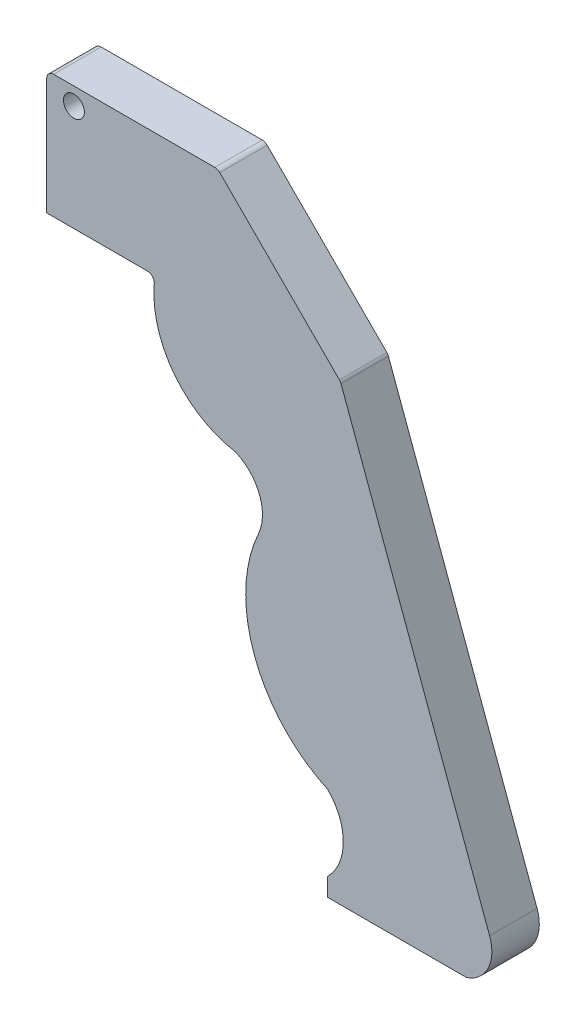
ISO-10303-21;
HEADER;
FILE_DESCRIPTION(('STEP AP214'),'2;1');
FILE_NAME('part.step','',(''),(''),'','','');
FILE_SCHEMA(('AUTOMOTIVE_DESIGN { 1 0 10303 214 1 1 1 1 }'));
ENDSEC;
DATA;
#1=APPLICATION_CONTEXT('core data for automotive mechanical design processes');
#2=APPLICATION_PROTOCOL_DEFINITION('international standard','automotive_design',2000,#1);
#3=PRODUCT_CONTEXT('',#1,'mechanical');
#4=PRODUCT('Part','Part','',(#3));
#5=PRODUCT_RELATED_PRODUCT_CATEGORY('part','',(#4));
#6=PRODUCT_DEFINITION_FORMATION('','',#4);
#7=PRODUCT_DEFINITION_CONTEXT('part definition',#1,'design');
#8=PRODUCT_DEFINITION('design','',#6,#7);
#9=PRODUCT_DEFINITION_SHAPE('','',#8);
#10=(LENGTH_UNIT() NAMED_UNIT(*) SI_UNIT(.MILLI.,.METRE.));
#11=(NAMED_UNIT(*) PLANE_ANGLE_UNIT() SI_UNIT($,.RADIAN.));
#12=(NAMED_UNIT(*) SI_UNIT($,.STERADIAN.) SOLID_ANGLE_UNIT());
#13=UNCERTAINTY_MEASURE_WITH_UNIT(LENGTH_MEASURE(1.E-05),#10,'distance_accuracy_value','');
#14=(GEOMETRIC_REPRESENTATION_CONTEXT(3) GLOBAL_UNCERTAINTY_ASSIGNED_CONTEXT((#13)) GLOBAL_UNIT_ASSIGNED_CONTEXT((#10,
#11,#12)) REPRESENTATION_CONTEXT('',''));
#15=CARTESIAN_POINT('',(0.,0.,0.));
#16=DIRECTION('',(0.,0.,1.));
#17=DIRECTION('',(1.,0.,0.));
#18=AXIS2_PLACEMENT_3D('',#15,#16,#17);
#19=CARTESIAN_POINT('',(15.5595718799986,0.,3.4));
#20=DIRECTION('',(0.,1.,0.));
#21=DIRECTION('',(0.,0.,1.));
#22=AXIS2_PLACEMENT_3D('',#19,#20,#21);
#23=PLANE('',#22);
#24=DIRECTION('',(1.,0.,0.));
#25=VECTOR('',#24,1.);
#26=CARTESIAN_POINT('',(15.5595718799986,0.,-3.4));
#27=LINE('',#26,#25);
#28=CARTESIAN_POINT('',(0.,0.,-3.4));
#29=VERTEX_POINT('',#28);
#30=CARTESIAN_POINT('',(14.4252310967925,0.,-3.4));
#31=VERTEX_POINT('',#30);
#32=EDGE_CURVE('E201',#29,#31,#27,.T.);
#33=ORIENTED_EDGE('',*,*,#32,.T.);
#34=DIRECTION('',(0.,0.,1.));
#35=VECTOR('',#34,1.);
#36=CARTESIAN_POINT('',(14.4252310967925,0.,3.4));
#37=LINE('',#36,#35);
#38=CARTESIAN_POINT('',(14.4252310967925,0.,3.4));
#39=VERTEX_POINT('',#38);
#40=EDGE_CURVE('E247',#31,#39,#37,.T.);
#41=ORIENTED_EDGE('',*,*,#40,.T.);
#42=DIRECTION('',(1.,0.,0.));
#43=VECTOR('',#42,1.);
#44=CARTESIAN_POINT('',(15.5595718799986,0.,3.4));
#45=LINE('',#44,#43);
#46=CARTESIAN_POINT('',(0.,0.,3.4));
#47=VERTEX_POINT('',#46);
#48=EDGE_CURVE('E163',#47,#39,#45,.T.);
#49=ORIENTED_EDGE('',*,*,#48,.F.);
#50=DIRECTION('',(0.,0.,-1.));
#51=VECTOR('',#50,1.);
#52=CARTESIAN_POINT('',(0.,0.,3.4));
#53=LINE('',#52,#51);
#54=EDGE_CURVE('E200',#47,#29,#53,.T.);
#55=ORIENTED_EDGE('',*,*,#54,.T.);
#56=EDGE_LOOP('',(#33,#41,#49,#55));
#57=FACE_BOUND('',#56,.T.);
#58=ADVANCED_FACE('F39',(#57),#23,.F.);
#59=CARTESIAN_POINT('',(29.3983016917173,-2.31085777021878,3.4));
#60=DIRECTION('',(0.,0.,-1.));
#61=DIRECTION('',(-1.,0.,0.));
#62=AXIS2_PLACEMENT_3D('',#59,#60,#61);
#63=CYLINDRICAL_SURFACE('',#62,14.0303423492063);
#64=CARTESIAN_POINT('',(29.3983016917173,-2.31085777021878,3.4));
#65=DIRECTION('',(0.,0.,1.));
#66=DIRECTION('',(-1.,0.,0.));
#67=AXIS2_PLACEMENT_3D('',#64,#65,#66);
#68=CIRCLE('',#67,14.0303423492063);
#69=CARTESIAN_POINT('',(15.4214206876247,-1.08721409930413,3.4));
#70=VERTEX_POINT('',#69);
#71=CARTESIAN_POINT('',(27.0874439214985,-16.1495875819375,3.4));
#72=VERTEX_POINT('',#71);
#73=EDGE_CURVE('E151',#70,#72,#68,.T.);
#74=ORIENTED_EDGE('',*,*,#73,.F.);
#75=DIRECTION('',(0.,0.,-1.));
#76=VECTOR('',#75,1.);
#77=CARTESIAN_POINT('',(15.4214206876247,-1.08721409930413,3.4));
#78=LINE('',#77,#76);
#79=CARTESIAN_POINT('',(15.4214206876247,-1.08721409930413,-3.4));
#80=VERTEX_POINT('',#79);
#81=EDGE_CURVE('E172',#70,#80,#78,.T.);
#82=ORIENTED_EDGE('',*,*,#81,.T.);
#83=CARTESIAN_POINT('',(29.3983016917173,-2.31085777021878,-3.4));
#84=DIRECTION('',(0.,0.,1.));
#85=DIRECTION('',(-1.,0.,0.));
#86=AXIS2_PLACEMENT_3D('',#83,#84,#85);
#87=CIRCLE('',#86,14.0303423492063);
#88=CARTESIAN_POINT('',(27.0874439214985,-16.1495875819375,-3.4));
#89=VERTEX_POINT('',#88);
#90=EDGE_CURVE('E169',#80,#89,#87,.T.);
#91=ORIENTED_EDGE('',*,*,#90,.T.);
#92=DIRECTION('',(0.,0.,-1.));
#93=VECTOR('',#92,1.);
#94=CARTESIAN_POINT('',(27.0874439214985,-16.1495875819375,3.4));
#95=LINE('',#94,#93);
#96=EDGE_CURVE('E166',#72,#89,#95,.T.);
#97=ORIENTED_EDGE('',*,*,#96,.F.);
#98=EDGE_LOOP('',(#74,#82,#91,#97));
#99=FACE_BOUND('',#98,.T.);
#100=ADVANCED_FACE('F167',(#99),#63,.T.);
#101=CARTESIAN_POINT('',(24.5341654416993,-22.0150061198059,3.4));
#102=DIRECTION('',(0.,0.,-1.));
#103=DIRECTION('',(-1.,0.,0.));
#104=AXIS2_PLACEMENT_3D('',#101,#102,#103);
#105=CYLINDRICAL_SURFACE('',#104,6.39705913836792);
#106=CARTESIAN_POINT('',(24.5341654416993,-22.0150061198059,-3.4));
#107=DIRECTION('',(0.,0.,-1.));
#108=DIRECTION('',(1.,0.,0.));
#109=AXIS2_PLACEMENT_3D('',#106,#107,#108);
#110=CIRCLE('',#109,6.39705913836792);
#111=CARTESIAN_POINT('',(30.3995839795678,-24.5682845996051,-3.4));
#112=VERTEX_POINT('',#111);
#113=EDGE_CURVE('E206',#89,#112,#110,.T.);
#114=ORIENTED_EDGE('',*,*,#113,.T.);
#115=DIRECTION('',(0.,0.,-1.));
#116=VECTOR('',#115,1.);
#117=CARTESIAN_POINT('',(30.3995839795678,-24.5682845996051,3.4));
#118=LINE('',#117,#116);
#119=CARTESIAN_POINT('',(30.3995839795678,-24.5682845996051,3.4));
#120=VERTEX_POINT('',#119);
#121=EDGE_CURVE('E173',#120,#112,#118,.T.);
#122=ORIENTED_EDGE('',*,*,#121,.F.);
#123=CARTESIAN_POINT('',(24.5341654416993,-22.0150061198059,3.4));
#124=DIRECTION('',(0.,0.,-1.));
#125=DIRECTION('',(1.,0.,0.));
#126=AXIS2_PLACEMENT_3D('',#123,#124,#125);
#127=CIRCLE('',#126,6.39705913836792);
#128=EDGE_CURVE('E156',#72,#120,#127,.T.);
#129=ORIENTED_EDGE('',*,*,#128,.F.);
#130=ORIENTED_EDGE('',*,*,#96,.T.);
#131=EDGE_LOOP('',(#114,#122,#129,#130));
#132=FACE_BOUND('',#131,.T.);
#133=ADVANCED_FACE('F175',(#132),#105,.F.);
#134=CARTESIAN_POINT('',(48.7766265018622,-33.0568108300749,3.4));
#135=DIRECTION('',(0.,0.,-1.));
#136=DIRECTION('',(-1.,0.,0.));
#137=AXIS2_PLACEMENT_3D('',#134,#135,#136);
#138=CYLINDRICAL_SURFACE('',#137,20.2427954944862);
#139=CARTESIAN_POINT('',(48.7766265018622,-33.0568108300749,-3.4));
#140=DIRECTION('',(0.,0.,1.));
#141=DIRECTION('',(-1.,0.,0.));
#142=AXIS2_PLACEMENT_3D('',#139,#140,#141);
#143=CIRCLE('',#142,20.2427954944862);
#144=CARTESIAN_POINT('',(40.2881002713919,-51.4338533523691,-3.4));
#145=VERTEX_POINT('',#144);
#146=EDGE_CURVE('E208',#112,#145,#143,.T.);
#147=ORIENTED_EDGE('',*,*,#146,.T.);
#148=DIRECTION('',(0.,0.,-1.));
#149=VECTOR('',#148,1.);
#150=CARTESIAN_POINT('',(40.2881002713919,-51.4338533523691,3.4));
#151=LINE('',#150,#149);
#152=CARTESIAN_POINT('',(40.2881002713919,-51.4338533523691,3.4));
#153=VERTEX_POINT('',#152);
#154=EDGE_CURVE('E242',#153,#145,#151,.T.);
#155=ORIENTED_EDGE('',*,*,#154,.F.);
#156=CARTESIAN_POINT('',(48.7766265018622,-33.0568108300749,3.4));
#157=DIRECTION('',(0.,0.,1.));
#158=DIRECTION('',(-1.,0.,0.));
#159=AXIS2_PLACEMENT_3D('',#156,#157,#158);
#160=CIRCLE('',#159,20.2427954944862);
#161=EDGE_CURVE('E178',#120,#153,#160,.T.);
#162=ORIENTED_EDGE('',*,*,#161,.F.);
#163=ORIENTED_EDGE('',*,*,#121,.T.);
#164=EDGE_LOOP('',(#147,#155,#162,#163));
#165=FACE_BOUND('',#164,.T.);
#166=ADVANCED_FACE('F307',(#165),#138,.T.);
#167=CARTESIAN_POINT('',(34.8950269475765,-56.8269266761845,3.4));
#168=DIRECTION('',(0.,0.,-1.));
#169=DIRECTION('',(-1.,0.,0.));
#170=AXIS2_PLACEMENT_3D('',#167,#168,#169);
#171=CYLINDRICAL_SURFACE('',#170,7.6269574374124);
#172=CARTESIAN_POINT('',(34.8950269475765,-56.8269266761845,-3.4));
#173=DIRECTION('',(0.,0.,-1.));
#174=DIRECTION('',(1.,0.,0.));
#175=AXIS2_PLACEMENT_3D('',#172,#173,#174);
#176=CIRCLE('',#175,7.6269574374124);
#177=CARTESIAN_POINT('',(40.288100271392,-62.22,-3.4));
#178=VERTEX_POINT('',#177);
#179=EDGE_CURVE('E210',#145,#178,#176,.T.);
#180=ORIENTED_EDGE('',*,*,#179,.T.);
#181=DIRECTION('',(0.,0.,-1.));
#182=VECTOR('',#181,1.);
#183=CARTESIAN_POINT('',(40.288100271392,-62.22,3.4));
#184=LINE('',#183,#182);
#185=CARTESIAN_POINT('',(40.288100271392,-62.22,3.4));
#186=VERTEX_POINT('',#185);
#187=EDGE_CURVE('E239',#186,#178,#184,.T.);
#188=ORIENTED_EDGE('',*,*,#187,.F.);
#189=CARTESIAN_POINT('',(34.8950269475765,-56.8269266761845,3.4));
#190=DIRECTION('',(0.,0.,-1.));
#191=DIRECTION('',(1.,0.,0.));
#192=AXIS2_PLACEMENT_3D('',#189,#190,#191);
#193=CIRCLE('',#192,7.6269574374124);
#194=EDGE_CURVE('E180',#153,#186,#193,.T.);
#195=ORIENTED_EDGE('',*,*,#194,.F.);
#196=ORIENTED_EDGE('',*,*,#154,.T.);
#197=EDGE_LOOP('',(#180,#188,#195,#196));
#198=FACE_BOUND('',#197,.T.);
#199=ADVANCED_FACE('F310',(#198),#171,.F.);
#200=CARTESIAN_POINT('',(40.288100271392,-64.84,3.4));
#201=DIRECTION('',(1.,0.,0.));
#202=DIRECTION('',(0.,1.,0.));
#203=AXIS2_PLACEMENT_3D('',#200,#201,#202);
#204=PLANE('',#203);
#205=DIRECTION('',(0.,-1.,0.));
#206=VECTOR('',#205,1.);
#207=CARTESIAN_POINT('',(40.288100271392,-64.84,-3.4));
#208=LINE('',#207,#206);
#209=CARTESIAN_POINT('',(40.288100271392,-64.84,-3.4));
#210=VERTEX_POINT('',#209);
#211=EDGE_CURVE('E212',#178,#210,#208,.T.);
#212=ORIENTED_EDGE('',*,*,#211,.T.);
#213=DIRECTION('',(0.,0.,-1.));
#214=VECTOR('',#213,1.);
#215=CARTESIAN_POINT('',(40.288100271392,-64.84,3.4));
#216=LINE('',#215,#214);
#217=CARTESIAN_POINT('',(40.288100271392,-64.84,3.4));
#218=VERTEX_POINT('',#217);
#219=EDGE_CURVE('E236',#218,#210,#216,.T.);
#220=ORIENTED_EDGE('',*,*,#219,.F.);
#221=DIRECTION('',(0.,-1.,0.));
#222=VECTOR('',#221,1.);
#223=CARTESIAN_POINT('',(40.288100271392,-64.84,3.4));
#224=LINE('',#223,#222);
#225=EDGE_CURVE('E185',#186,#218,#224,.T.);
#226=ORIENTED_EDGE('',*,*,#225,.F.);
#227=ORIENTED_EDGE('',*,*,#187,.T.);
#228=EDGE_LOOP('',(#212,#220,#226,#227));
#229=FACE_BOUND('',#228,.T.);
#230=ADVANCED_FACE('F314',(#229),#204,.F.);
#231=CARTESIAN_POINT('',(60.168100271392,-64.84,3.4));
#232=DIRECTION('',(0.,1.,0.));
#233=DIRECTION('',(0.,0.,1.));
#234=AXIS2_PLACEMENT_3D('',#231,#232,#233);
#235=PLANE('',#234);
#236=DIRECTION('',(1.,0.,0.));
#237=VECTOR('',#236,1.);
#238=CARTESIAN_POINT('',(60.168100271392,-64.84,-3.4));
#239=LINE('',#238,#237);
#240=CARTESIAN_POINT('',(60.168100271392,-64.84,-3.4));
#241=VERTEX_POINT('',#240);
#242=EDGE_CURVE('E214',#210,#241,#239,.T.);
#243=ORIENTED_EDGE('',*,*,#242,.T.);
#244=DIRECTION('',(0.,0.,-1.));
#245=VECTOR('',#244,1.);
#246=CARTESIAN_POINT('',(60.168100271392,-64.84,3.4));
#247=LINE('',#246,#245);
#248=CARTESIAN_POINT('',(60.168100271392,-64.84,3.4));
#249=VERTEX_POINT('',#248);
#250=EDGE_CURVE('E233',#249,#241,#247,.T.);
#251=ORIENTED_EDGE('',*,*,#250,.F.);
#252=DIRECTION('',(1.,0.,0.));
#253=VECTOR('',#252,1.);
#254=CARTESIAN_POINT('',(60.168100271392,-64.84,3.4));
#255=LINE('',#254,#253);
#256=EDGE_CURVE('E187',#218,#249,#255,.T.);
#257=ORIENTED_EDGE('',*,*,#256,.F.);
#258=ORIENTED_EDGE('',*,*,#219,.T.);
#259=EDGE_LOOP('',(#243,#251,#257,#258));
#260=FACE_BOUND('',#259,.T.);
#261=ADVANCED_FACE('F318',(#260),#235,.F.);
#262=CARTESIAN_POINT('',(58.542299867003,-59.8161238810148,3.4));
#263=DIRECTION('',(0.,0.,-1.));
#264=DIRECTION('',(-1.,0.,0.));
#265=AXIS2_PLACEMENT_3D('',#262,#263,#264);
#266=CYLINDRICAL_SURFACE('',#265,5.28039375556608);
#267=CARTESIAN_POINT('',(58.542299867003,-59.8161238810148,-3.4));
#268=DIRECTION('',(0.,0.,1.));
#269=DIRECTION('',(-1.,0.,0.));
#270=AXIS2_PLACEMENT_3D('',#267,#268,#269);
#271=CIRCLE('',#270,5.28039375556608);
#272=CARTESIAN_POINT('',(63.4976787126544,-57.9921779635347,-3.4));
#273=VERTEX_POINT('',#272);
#274=EDGE_CURVE('E216',#241,#273,#271,.T.);
#275=ORIENTED_EDGE('',*,*,#274,.T.);
#276=DIRECTION('',(0.,0.,-1.));
#277=VECTOR('',#276,1.);
#278=CARTESIAN_POINT('',(63.4976787126544,-57.9921779635347,3.4));
#279=LINE('',#278,#277);
#280=CARTESIAN_POINT('',(63.4976787126544,-57.9921779635347,3.4));
#281=VERTEX_POINT('',#280);
#282=EDGE_CURVE('E230',#281,#273,#279,.T.);
#283=ORIENTED_EDGE('',*,*,#282,.F.);
#284=CARTESIAN_POINT('',(58.542299867003,-59.8161238810148,3.4));
#285=DIRECTION('',(0.,0.,1.));
#286=DIRECTION('',(-1.,0.,0.));
#287=AXIS2_PLACEMENT_3D('',#284,#285,#286);
#288=CIRCLE('',#287,5.28039375556608);
#289=EDGE_CURVE('E189',#249,#281,#288,.T.);
#290=ORIENTED_EDGE('',*,*,#289,.F.);
#291=ORIENTED_EDGE('',*,*,#250,.T.);
#292=EDGE_LOOP('',(#275,#283,#290,#291));
#293=FACE_BOUND('',#292,.T.);
#294=ADVANCED_FACE('F322',(#293),#266,.T.);
#295=CARTESIAN_POINT('',(42.1128167159213,0.10718328407869,3.4));
#296=DIRECTION('',(-0.938448736029937,-0.345418542993589,0.));
#297=DIRECTION('',(0.345418542993589,-0.938448736029937,0.));
#298=AXIS2_PLACEMENT_3D('',#295,#296,#297);
#299=PLANE('',#298);
#300=DIRECTION('',(-0.345418542993589,0.938448736029937,0.));
#301=VECTOR('',#300,1.);
#302=CARTESIAN_POINT('',(42.1128167159213,0.10718328407869,-3.4));
#303=LINE('',#302,#301);
#304=CARTESIAN_POINT('',(42.188738690566,-0.0990849739155566,-3.4));
#305=VERTEX_POINT('',#304);
#306=EDGE_CURVE('E218',#273,#305,#303,.T.);
#307=ORIENTED_EDGE('',*,*,#306,.T.);
#308=DIRECTION('',(0.,0.,-1.));
#309=VECTOR('',#308,1.);
#310=CARTESIAN_POINT('',(42.188738690566,-0.0990849739155557,3.4));
#311=LINE('',#310,#309);
#312=CARTESIAN_POINT('',(42.188738690566,-0.0990849739155566,3.4));
#313=VERTEX_POINT('',#312);
#314=EDGE_CURVE('E260',#305,#313,#311,.F.);
#315=ORIENTED_EDGE('',*,*,#314,.T.);
#316=DIRECTION('',(-0.345418542993589,0.938448736029937,0.));
#317=VECTOR('',#316,1.);
#318=CARTESIAN_POINT('',(42.1128167159213,0.10718328407869,3.4));
#319=LINE('',#318,#317);
#320=EDGE_CURVE('E191',#281,#313,#319,.T.);
#321=ORIENTED_EDGE('',*,*,#320,.F.);
#322=ORIENTED_EDGE('',*,*,#282,.T.);
#323=EDGE_LOOP('',(#307,#315,#321,#322));
#324=FACE_BOUND('',#323,.T.);
#325=ADVANCED_FACE('F325',(#324),#299,.F.);
#326=CARTESIAN_POINT('',(24.52,17.7,3.4));
#327=DIRECTION('',(-0.707106781186547,-0.707106781186548,0.));
#328=DIRECTION('',(0.707106781186548,-0.707106781186547,0.));
#329=AXIS2_PLACEMENT_3D('',#326,#327,#328);
#330=PLANE('',#329);
#331=DIRECTION('',(-0.707106781186548,0.707106781186547,0.));
#332=VECTOR('',#331,1.);
#333=CARTESIAN_POINT('',(24.52,17.7,3.4));
#334=LINE('',#333,#332);
#335=CARTESIAN_POINT('',(41.9573967357226,0.262603264277402,3.4));
#336=VERTEX_POINT('',#335);
#337=CARTESIAN_POINT('',(24.8128932188135,17.4071067811865,3.4));
#338=VERTEX_POINT('',#337);
#339=EDGE_CURVE('E193',#336,#338,#334,.T.);
#340=ORIENTED_EDGE('',*,*,#339,.F.);
#341=DIRECTION('',(0.,0.,-1.));
#342=VECTOR('',#341,1.);
#343=CARTESIAN_POINT('',(41.9573967357226,0.262603264277402,3.4));
#344=LINE('',#343,#342);
#345=CARTESIAN_POINT('',(41.9573967357226,0.262603264277402,-3.4));
#346=VERTEX_POINT('',#345);
#347=EDGE_CURVE('E251',#336,#346,#344,.T.);
#348=ORIENTED_EDGE('',*,*,#347,.T.);
#349=DIRECTION('',(-0.707106781186548,0.707106781186547,0.));
#350=VECTOR('',#349,1.);
#351=CARTESIAN_POINT('',(24.52,17.7,-3.4));
#352=LINE('',#351,#350);
#353=CARTESIAN_POINT('',(24.8128932188135,17.4071067811865,-3.4));
#354=VERTEX_POINT('',#353);
#355=EDGE_CURVE('E221',#346,#354,#352,.T.);
#356=ORIENTED_EDGE('',*,*,#355,.T.);
#357=DIRECTION('',(0.,0.,-1.));
#358=VECTOR('',#357,1.);
#359=CARTESIAN_POINT('',(24.8128932188135,17.4071067811865,3.4));
#360=LINE('',#359,#358);
#361=EDGE_CURVE('E249',#354,#338,#360,.F.);
#362=ORIENTED_EDGE('',*,*,#361,.T.);
#363=EDGE_LOOP('',(#340,#348,#356,#362));
#364=FACE_BOUND('',#363,.T.);
#365=ADVANCED_FACE('F329',(#364),#330,.F.);
#366=CARTESIAN_POINT('',(0.,17.7,3.4));
#367=DIRECTION('',(0.,-1.,0.));
#368=DIRECTION('',(0.,0.,-1.));
#369=AXIS2_PLACEMENT_3D('',#366,#367,#368);
#370=PLANE('',#369);
#371=DIRECTION('',(-1.,0.,0.));
#372=VECTOR('',#371,1.);
#373=CARTESIAN_POINT('',(0.,17.7,3.4));
#374=LINE('',#373,#372);
#375=CARTESIAN_POINT('',(24.1057864376269,17.7,3.4));
#376=VERTEX_POINT('',#375);
#377=CARTESIAN_POINT('',(1.,17.7,3.4));
#378=VERTEX_POINT('',#377);
#379=EDGE_CURVE('E196',#376,#378,#374,.T.);
#380=ORIENTED_EDGE('',*,*,#379,.F.);
#381=DIRECTION('',(0.,0.,-1.));
#382=VECTOR('',#381,1.);
#383=CARTESIAN_POINT('',(24.1057864376269,17.7,3.4));
#384=LINE('',#383,#382);
#385=CARTESIAN_POINT('',(24.1057864376269,17.7,-3.4));
#386=VERTEX_POINT('',#385);
#387=EDGE_CURVE('E268',#376,#386,#384,.T.);
#388=ORIENTED_EDGE('',*,*,#387,.T.);
#389=DIRECTION('',(-1.,0.,0.));
#390=VECTOR('',#389,1.);
#391=CARTESIAN_POINT('',(0.,17.7,-3.4));
#392=LINE('',#391,#390);
#393=CARTESIAN_POINT('',(1.,17.7,-3.4));
#394=VERTEX_POINT('',#393);
#395=EDGE_CURVE('E224',#386,#394,#392,.T.);
#396=ORIENTED_EDGE('',*,*,#395,.T.);
#397=DIRECTION('',(0.,0.,-1.));
#398=VECTOR('',#397,1.);
#399=CARTESIAN_POINT('',(1.,17.7,3.4));
#400=LINE('',#399,#398);
#401=EDGE_CURVE('E62',#394,#378,#400,.F.);
#402=ORIENTED_EDGE('',*,*,#401,.T.);
#403=EDGE_LOOP('',(#380,#388,#396,#402));
#404=FACE_BOUND('',#403,.T.);
#405=ADVANCED_FACE('F333',(#404),#370,.F.);
#406=CARTESIAN_POINT('',(0.,0.,3.4));
#407=DIRECTION('',(1.,0.,0.));
#408=DIRECTION('',(0.,0.,-1.));
#409=AXIS2_PLACEMENT_3D('',#406,#407,#408);
#410=PLANE('',#409);
#411=DIRECTION('',(0.,-1.,0.));
#412=VECTOR('',#411,1.);
#413=CARTESIAN_POINT('',(0.,0.,3.4));
#414=LINE('',#413,#412);
#415=CARTESIAN_POINT('',(0.,16.7,3.4));
#416=VERTEX_POINT('',#415);
#417=EDGE_CURVE('E198',#416,#47,#414,.T.);
#418=ORIENTED_EDGE('',*,*,#417,.F.);
#419=DIRECTION('',(0.,0.,-1.));
#420=VECTOR('',#419,1.);
#421=CARTESIAN_POINT('',(0.,16.7,3.4));
#422=LINE('',#421,#420);
#423=CARTESIAN_POINT('',(0.,16.7,-3.4));
#424=VERTEX_POINT('',#423);
#425=EDGE_CURVE('E271',#416,#424,#422,.T.);
#426=ORIENTED_EDGE('',*,*,#425,.T.);
#427=DIRECTION('',(0.,-1.,0.));
#428=VECTOR('',#427,1.);
#429=CARTESIAN_POINT('',(0.,0.,-3.4));
#430=LINE('',#429,#428);
#431=EDGE_CURVE('E226',#424,#29,#430,.T.);
#432=ORIENTED_EDGE('',*,*,#431,.T.);
#433=ORIENTED_EDGE('',*,*,#54,.F.);
#434=EDGE_LOOP('',(#418,#426,#432,#433));
#435=FACE_BOUND('',#434,.T.);
#436=ADVANCED_FACE('F337',(#435),#410,.F.);
#437=CARTESIAN_POINT('',(58.542299867003,-59.8161238810148,3.4));
#438=DIRECTION('',(0.,0.,-1.));
#439=DIRECTION('',(-1.,0.,0.));
#440=AXIS2_PLACEMENT_3D('',#437,#438,#439);
#441=PLANE('',#440);
#442=CARTESIAN_POINT('',(3.9,15.2,3.4));
#443=DIRECTION('',(0.,0.,1.));
#444=DIRECTION('',(1.,0.,0.));
#445=AXIS2_PLACEMENT_3D('',#442,#443,#444);
#446=CIRCLE('',#445,1.5);
#447=CARTESIAN_POINT('',(5.4,15.2,3.4));
#448=VERTEX_POINT('',#447);
#449=EDGE_CURVE('E355',#448,#448,#446,.T.);
#450=ORIENTED_EDGE('',*,*,#449,.F.);
#451=EDGE_LOOP('',(#450));
#452=FACE_BOUND('',#451,.T.);
#453=ORIENTED_EDGE('',*,*,#320,.T.);
#454=CARTESIAN_POINT('',(41.250289954536,-0.444503516909146,3.4));
#455=DIRECTION('',(0.,0.,-1.));
#456=DIRECTION('',(-1.,0.,0.));
#457=AXIS2_PLACEMENT_3D('',#454,#455,#456);
#458=CIRCLE('',#457,1.);
#459=EDGE_CURVE('E265',#313,#336,#458,.F.);
#460=ORIENTED_EDGE('',*,*,#459,.T.);
#461=ORIENTED_EDGE('',*,*,#339,.T.);
#462=CARTESIAN_POINT('',(24.1057864376269,16.7,3.4));
#463=DIRECTION('',(0.,0.,-1.));
#464=DIRECTION('',(-1.,0.,0.));
#465=AXIS2_PLACEMENT_3D('',#462,#463,#464);
#466=CIRCLE('',#465,1.);
#467=EDGE_CURVE('E263',#338,#376,#466,.F.);
#468=ORIENTED_EDGE('',*,*,#467,.T.);
#469=ORIENTED_EDGE('',*,*,#379,.T.);
#470=CARTESIAN_POINT('',(1.,16.7,3.4));
#471=DIRECTION('',(0.,0.,-1.));
#472=DIRECTION('',(-1.,0.,0.));
#473=AXIS2_PLACEMENT_3D('',#470,#471,#472);
#474=CIRCLE('',#473,1.);
#475=EDGE_CURVE('E54',#378,#416,#474,.F.);
#476=ORIENTED_EDGE('',*,*,#475,.T.);
#477=ORIENTED_EDGE('',*,*,#417,.T.);
#478=ORIENTED_EDGE('',*,*,#48,.T.);
#479=CARTESIAN_POINT('',(14.4252310967925,-1.,3.4));
#480=DIRECTION('',(0.,0.,-1.));
#481=DIRECTION('',(-1.,0.,0.));
#482=AXIS2_PLACEMENT_3D('',#479,#480,#481);
#483=CIRCLE('',#482,1.);
#484=EDGE_CURVE('E11',#39,#70,#483,.T.);
#485=ORIENTED_EDGE('',*,*,#484,.T.);
#486=ORIENTED_EDGE('',*,*,#73,.T.);
#487=ORIENTED_EDGE('',*,*,#128,.T.);
#488=ORIENTED_EDGE('',*,*,#161,.T.);
#489=ORIENTED_EDGE('',*,*,#194,.T.);
#490=ORIENTED_EDGE('',*,*,#225,.T.);
#491=ORIENTED_EDGE('',*,*,#256,.T.);
#492=ORIENTED_EDGE('',*,*,#289,.T.);
#493=EDGE_LOOP('',(#453,#460,#461,#468,#469,#476,#477,#478,#485,#486,#487,#488,#489,#490,#491,#492));
#494=FACE_BOUND('',#493,.T.);
#495=ADVANCED_FACE('F154',(#452,#494),#441,.F.);
#496=CARTESIAN_POINT('',(58.542299867003,-59.8161238810148,-3.4));
#497=DIRECTION('',(0.,0.,-1.));
#498=DIRECTION('',(-1.,0.,0.));
#499=AXIS2_PLACEMENT_3D('',#496,#497,#498);
#500=PLANE('',#499);
#501=CARTESIAN_POINT('',(3.9,15.2,-3.4));
#502=DIRECTION('',(0.,0.,1.));
#503=DIRECTION('',(1.,0.,0.));
#504=AXIS2_PLACEMENT_3D('',#501,#502,#503);
#505=CIRCLE('',#504,1.5);
#506=CARTESIAN_POINT('',(5.4,15.2,-3.4));
#507=VERTEX_POINT('',#506);
#508=EDGE_CURVE('E204',#507,#507,#505,.T.);
#509=ORIENTED_EDGE('',*,*,#508,.T.);
#510=EDGE_LOOP('',(#509));
#511=FACE_BOUND('',#510,.T.);
#512=ORIENTED_EDGE('',*,*,#355,.F.);
#513=CARTESIAN_POINT('',(41.250289954536,-0.444503516909146,-3.4));
#514=DIRECTION('',(0.,0.,-1.));
#515=DIRECTION('',(-1.,0.,0.));
#516=AXIS2_PLACEMENT_3D('',#513,#514,#515);
#517=CIRCLE('',#516,1.);
#518=EDGE_CURVE('E258',#346,#305,#517,.T.);
#519=ORIENTED_EDGE('',*,*,#518,.T.);
#520=ORIENTED_EDGE('',*,*,#306,.F.);
#521=ORIENTED_EDGE('',*,*,#274,.F.);
#522=ORIENTED_EDGE('',*,*,#242,.F.);
#523=ORIENTED_EDGE('',*,*,#211,.F.);
#524=ORIENTED_EDGE('',*,*,#179,.F.);
#525=ORIENTED_EDGE('',*,*,#146,.F.);
#526=ORIENTED_EDGE('',*,*,#113,.F.);
#527=ORIENTED_EDGE('',*,*,#90,.F.);
#528=CARTESIAN_POINT('',(14.4252310967925,-1.,-3.4));
#529=DIRECTION('',(0.,0.,-1.));
#530=DIRECTION('',(-1.,0.,0.));
#531=AXIS2_PLACEMENT_3D('',#528,#529,#530);
#532=CIRCLE('',#531,1.);
#533=EDGE_CURVE('E47',#80,#31,#532,.F.);
#534=ORIENTED_EDGE('',*,*,#533,.T.);
#535=ORIENTED_EDGE('',*,*,#32,.F.);
#536=ORIENTED_EDGE('',*,*,#431,.F.);
#537=CARTESIAN_POINT('',(1.,16.7,-3.4));
#538=DIRECTION('',(0.,0.,-1.));
#539=DIRECTION('',(-1.,0.,0.));
#540=AXIS2_PLACEMENT_3D('',#537,#538,#539);
#541=CIRCLE('',#540,1.);
#542=EDGE_CURVE('E254',#424,#394,#541,.T.);
#543=ORIENTED_EDGE('',*,*,#542,.T.);
#544=ORIENTED_EDGE('',*,*,#395,.F.);
#545=CARTESIAN_POINT('',(24.1057864376269,16.7,-3.4));
#546=DIRECTION('',(0.,0.,-1.));
#547=DIRECTION('',(-1.,0.,0.));
#548=AXIS2_PLACEMENT_3D('',#545,#546,#547);
#549=CIRCLE('',#548,1.);
#550=EDGE_CURVE('E256',#386,#354,#549,.T.);
#551=ORIENTED_EDGE('',*,*,#550,.T.);
#552=EDGE_LOOP('',(#512,#519,#520,#521,#522,#523,#524,#525,#526,#527,#534,#535,#536,#543,#544,#551));
#553=FACE_BOUND('',#552,.T.);
#554=ADVANCED_FACE('F276',(#511,#553),#500,.T.);
#555=CARTESIAN_POINT('',(14.4252310967925,-1.,3.4));
#556=DIRECTION('',(0.,0.,-1.));
#557=DIRECTION('',(-1.,0.,0.));
#558=AXIS2_PLACEMENT_3D('',#555,#556,#557);
#559=CYLINDRICAL_SURFACE('',#558,1.);
#560=ORIENTED_EDGE('',*,*,#484,.F.);
#561=ORIENTED_EDGE('',*,*,#40,.F.);
#562=ORIENTED_EDGE('',*,*,#533,.F.);
#563=ORIENTED_EDGE('',*,*,#81,.F.);
#564=EDGE_LOOP('',(#560,#561,#562,#563));
#565=FACE_BOUND('',#564,.T.);
#566=ADVANCED_FACE('F283',(#565),#559,.F.);
#567=CARTESIAN_POINT('',(41.250289954536,-0.444503516909146,3.4));
#568=DIRECTION('',(0.,0.,-1.));
#569=DIRECTION('',(-1.,0.,0.));
#570=AXIS2_PLACEMENT_3D('',#567,#568,#569);
#571=CYLINDRICAL_SURFACE('',#570,1.);
#572=ORIENTED_EDGE('',*,*,#459,.F.);
#573=ORIENTED_EDGE('',*,*,#314,.F.);
#574=ORIENTED_EDGE('',*,*,#518,.F.);
#575=ORIENTED_EDGE('',*,*,#347,.F.);
#576=EDGE_LOOP('',(#572,#573,#574,#575));
#577=FACE_BOUND('',#576,.T.);
#578=ADVANCED_FACE('F285',(#577),#571,.T.);
#579=CARTESIAN_POINT('',(24.1057864376269,16.7,3.4));
#580=DIRECTION('',(0.,0.,-1.));
#581=DIRECTION('',(-1.,0.,0.));
#582=AXIS2_PLACEMENT_3D('',#579,#580,#581);
#583=CYLINDRICAL_SURFACE('',#582,1.);
#584=ORIENTED_EDGE('',*,*,#467,.F.);
#585=ORIENTED_EDGE('',*,*,#361,.F.);
#586=ORIENTED_EDGE('',*,*,#550,.F.);
#587=ORIENTED_EDGE('',*,*,#387,.F.);
#588=EDGE_LOOP('',(#584,#585,#586,#587));
#589=FACE_BOUND('',#588,.T.);
#590=ADVANCED_FACE('F291',(#589),#583,.T.);
#591=CARTESIAN_POINT('',(1.,16.7,3.4));
#592=DIRECTION('',(0.,0.,-1.));
#593=DIRECTION('',(-1.,0.,0.));
#594=AXIS2_PLACEMENT_3D('',#591,#592,#593);
#595=CYLINDRICAL_SURFACE('',#594,1.);
#596=ORIENTED_EDGE('',*,*,#475,.F.);
#597=ORIENTED_EDGE('',*,*,#401,.F.);
#598=ORIENTED_EDGE('',*,*,#542,.F.);
#599=ORIENTED_EDGE('',*,*,#425,.F.);
#600=EDGE_LOOP('',(#596,#597,#598,#599));
#601=FACE_BOUND('',#600,.T.);
#602=ADVANCED_FACE('F41',(#601),#595,.T.);
#603=CARTESIAN_POINT('',(3.9,15.2,-3.4));
#604=DIRECTION('',(0.,0.,1.));
#605=DIRECTION('',(1.,0.,0.));
#606=AXIS2_PLACEMENT_3D('',#603,#604,#605);
#607=CYLINDRICAL_SURFACE('',#606,1.5);
#608=ORIENTED_EDGE('',*,*,#508,.F.);
#609=EDGE_LOOP('',(#608));
#610=FACE_BOUND('',#609,.T.);
#611=ORIENTED_EDGE('',*,*,#449,.T.);
#612=EDGE_LOOP('',(#611));
#613=FACE_BOUND('',#612,.T.);
#614=ADVANCED_FACE('F343',(#610,#613),#607,.F.);
#615=CLOSED_SHELL('',(#58,#100,#133,#166,#199,#230,#261,#294,#325,#365,#405,#436,#495,#554,#566,
#578,#590,#602,#614));
#616=MANIFOLD_SOLID_BREP('B2',#615);
#617=ADVANCED_BREP_SHAPE_REPRESENTATION('',(#18,#616),#14);
#618=SHAPE_DEFINITION_REPRESENTATION(#9,#617);
ENDSEC;
END-ISO-10303-21;
